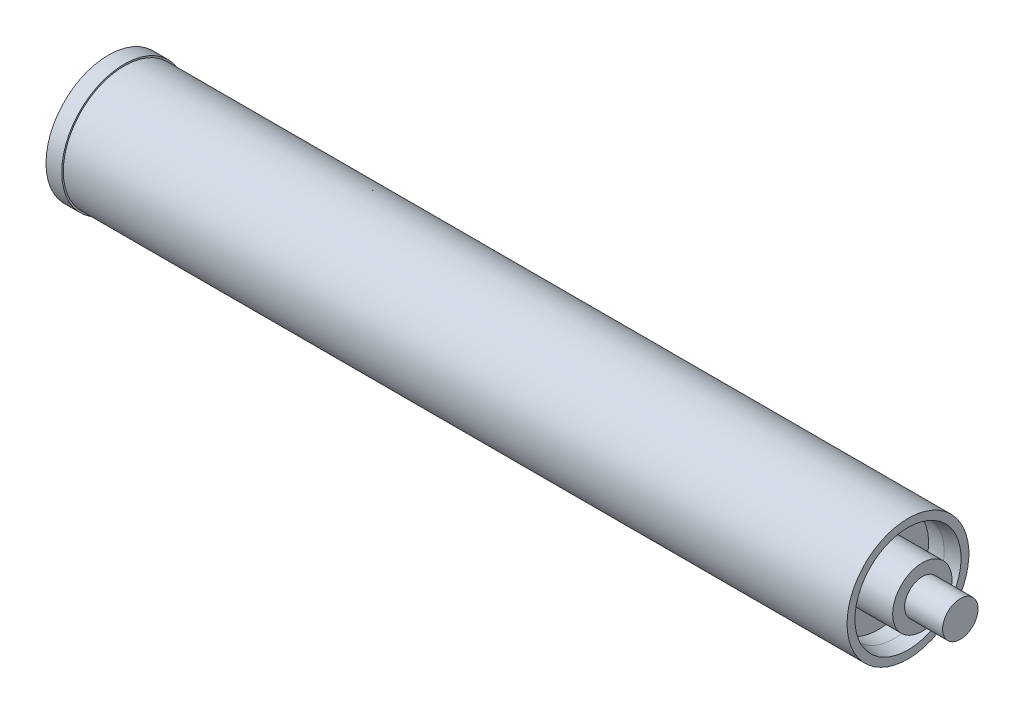
ISO-10303-21;
HEADER;
FILE_DESCRIPTION(('STEP AP214'),'2;1');
FILE_NAME('part.step','',(''),(''),'','','');
FILE_SCHEMA(('AUTOMOTIVE_DESIGN { 1 0 10303 214 1 1 1 1 }'));
ENDSEC;
DATA;
#1=APPLICATION_CONTEXT('core data for automotive mechanical design processes');
#2=APPLICATION_PROTOCOL_DEFINITION('international standard','automotive_design',2000,#1);
#3=PRODUCT_CONTEXT('',#1,'mechanical');
#4=PRODUCT('Part','Part','',(#3));
#5=PRODUCT_RELATED_PRODUCT_CATEGORY('part','',(#4));
#6=PRODUCT_DEFINITION_FORMATION('','',#4);
#7=PRODUCT_DEFINITION_CONTEXT('part definition',#1,'design');
#8=PRODUCT_DEFINITION('design','',#6,#7);
#9=PRODUCT_DEFINITION_SHAPE('','',#8);
#10=(LENGTH_UNIT() NAMED_UNIT(*) SI_UNIT(.MILLI.,.METRE.));
#11=(NAMED_UNIT(*) PLANE_ANGLE_UNIT() SI_UNIT($,.RADIAN.));
#12=(NAMED_UNIT(*) SI_UNIT($,.STERADIAN.) SOLID_ANGLE_UNIT());
#13=UNCERTAINTY_MEASURE_WITH_UNIT(LENGTH_MEASURE(1.E-05),#10,'distance_accuracy_value','');
#14=(GEOMETRIC_REPRESENTATION_CONTEXT(3) GLOBAL_UNCERTAINTY_ASSIGNED_CONTEXT((#13)) GLOBAL_UNIT_ASSIGNED_CONTEXT((#10,
#11,#12)) REPRESENTATION_CONTEXT('',''));
#15=CARTESIAN_POINT('',(0.,0.,0.));
#16=DIRECTION('',(0.,0.,1.));
#17=DIRECTION('',(1.,0.,0.));
#18=AXIS2_PLACEMENT_3D('',#15,#16,#17);
#19=CARTESIAN_POINT('',(36.5674158404261,35.6891384392189,0.));
#20=DIRECTION('',(1.,0.,0.));
#21=DIRECTION('',(0.,0.,-1.));
#22=AXIS2_PLACEMENT_3D('',#19,#20,#21);
#23=PLANE('',#22);
#24=CARTESIAN_POINT('',(36.5674158404261,0.,0.));
#25=DIRECTION('',(-1.,0.,0.));
#26=DIRECTION('',(0.,0.,1.));
#27=AXIS2_PLACEMENT_3D('',#24,#25,#26);
#28=CIRCLE('',#27,26.);
#29=CARTESIAN_POINT('',(36.5674158404261,0.,26.));
#30=VERTEX_POINT('',#29);
#31=EDGE_CURVE('E83',#30,#30,#28,.T.);
#32=ORIENTED_EDGE('',*,*,#31,.F.);
#33=EDGE_LOOP('',(#32));
#34=FACE_BOUND('',#33,.T.);
#35=CARTESIAN_POINT('',(36.5674158404261,0.,0.));
#36=DIRECTION('',(-1.,0.,0.));
#37=DIRECTION('',(0.,0.,1.));
#38=AXIS2_PLACEMENT_3D('',#35,#36,#37);
#39=CIRCLE('',#38,35.6891384392189);
#40=CARTESIAN_POINT('',(36.5674158404261,0.,35.6891384392189));
#41=VERTEX_POINT('',#40);
#42=EDGE_CURVE('E10',#41,#41,#39,.T.);
#43=ORIENTED_EDGE('',*,*,#42,.T.);
#44=EDGE_LOOP('',(#43));
#45=FACE_BOUND('',#44,.T.);
#46=ADVANCED_FACE('F31',(#34,#45),#23,.F.);
#47=CARTESIAN_POINT('',(0.,0.,0.));
#48=DIRECTION('',(-1.,0.,0.));
#49=DIRECTION('',(0.,0.,1.));
#50=AXIS2_PLACEMENT_3D('',#47,#48,#49);
#51=CYLINDRICAL_SURFACE('',#50,35.6891384392189);
#52=ORIENTED_EDGE('',*,*,#42,.F.);
#53=EDGE_LOOP('',(#52));
#54=FACE_BOUND('',#53,.T.);
#55=CARTESIAN_POINT('',(25.4,0.,0.));
#56=DIRECTION('',(-1.,0.,0.));
#57=DIRECTION('',(0.,0.,1.));
#58=AXIS2_PLACEMENT_3D('',#55,#56,#57);
#59=CIRCLE('',#58,35.6891384392189);
#60=CARTESIAN_POINT('',(25.4,0.,35.6891384392189));
#61=VERTEX_POINT('',#60);
#62=EDGE_CURVE('E37',#61,#61,#59,.T.);
#63=ORIENTED_EDGE('',*,*,#62,.T.);
#64=EDGE_LOOP('',(#63));
#65=FACE_BOUND('',#64,.T.);
#66=ADVANCED_FACE('F130',(#54,#65),#51,.F.);
#67=CARTESIAN_POINT('',(12.7,0.,0.));
#68=DIRECTION('',(-1.,0.,0.));
#69=DIRECTION('',(0.,0.,1.));
#70=AXIS2_PLACEMENT_3D('',#67,#68,#69);
#71=CONICAL_SURFACE('',#70,38.2095,0.195908259244877);
#72=ORIENTED_EDGE('',*,*,#62,.F.);
#73=EDGE_LOOP('',(#72));
#74=FACE_BOUND('',#73,.T.);
#75=CARTESIAN_POINT('',(12.7,0.,0.));
#76=DIRECTION('',(-1.,0.,0.));
#77=DIRECTION('',(0.,0.,1.));
#78=AXIS2_PLACEMENT_3D('',#75,#76,#77);
#79=CIRCLE('',#78,38.2095);
#80=CARTESIAN_POINT('',(12.7,0.,38.2095));
#81=VERTEX_POINT('',#80);
#82=EDGE_CURVE('E41',#81,#81,#79,.T.);
#83=ORIENTED_EDGE('',*,*,#82,.T.);
#84=EDGE_LOOP('',(#83));
#85=FACE_BOUND('',#84,.T.);
#86=ADVANCED_FACE('F135',(#74,#85),#71,.F.);
#87=CARTESIAN_POINT('',(12.7,50.419,0.));
#88=DIRECTION('',(1.,0.,0.));
#89=DIRECTION('',(0.,0.,-1.));
#90=AXIS2_PLACEMENT_3D('',#87,#88,#89);
#91=PLANE('',#90);
#92=ORIENTED_EDGE('',*,*,#82,.F.);
#93=EDGE_LOOP('',(#92));
#94=FACE_BOUND('',#93,.T.);
#95=CARTESIAN_POINT('',(12.7,0.,0.));
#96=DIRECTION('',(-1.,0.,0.));
#97=DIRECTION('',(0.,0.,1.));
#98=AXIS2_PLACEMENT_3D('',#95,#96,#97);
#99=CIRCLE('',#98,50.419);
#100=CARTESIAN_POINT('',(12.7,0.,50.419));
#101=VERTEX_POINT('',#100);
#102=EDGE_CURVE('E45',#101,#101,#99,.T.);
#103=ORIENTED_EDGE('',*,*,#102,.T.);
#104=EDGE_LOOP('',(#103));
#105=FACE_BOUND('',#104,.T.);
#106=ADVANCED_FACE('F141',(#94,#105),#91,.F.);
#107=CARTESIAN_POINT('',(0.,0.,0.));
#108=DIRECTION('',(-1.,0.,0.));
#109=DIRECTION('',(0.,0.,1.));
#110=AXIS2_PLACEMENT_3D('',#107,#108,#109);
#111=CYLINDRICAL_SURFACE('',#110,50.419);
#112=CARTESIAN_POINT('',(25.4,0.,0.));
#113=DIRECTION('',(-1.,0.,0.));
#114=DIRECTION('',(0.,0.,1.));
#115=AXIS2_PLACEMENT_3D('',#112,#113,#114);
#116=CIRCLE('',#115,50.419);
#117=CARTESIAN_POINT('',(25.4,0.,50.419));
#118=VERTEX_POINT('',#117);
#119=EDGE_CURVE('E50',#118,#118,#116,.T.);
#120=ORIENTED_EDGE('',*,*,#119,.T.);
#121=EDGE_LOOP('',(#120));
#122=FACE_BOUND('',#121,.T.);
#123=ORIENTED_EDGE('',*,*,#102,.F.);
#124=EDGE_LOOP('',(#123));
#125=FACE_BOUND('',#124,.T.);
#126=ADVANCED_FACE('F147',(#122,#125),#111,.T.);
#127=CARTESIAN_POINT('',(25.4,50.419,0.));
#128=DIRECTION('',(1.,0.,0.));
#129=DIRECTION('',(0.,0.,-1.));
#130=AXIS2_PLACEMENT_3D('',#127,#128,#129);
#131=PLANE('',#130);
#132=CARTESIAN_POINT('',(25.4,0.,0.));
#133=DIRECTION('',(-1.,0.,0.));
#134=DIRECTION('',(0.,0.,1.));
#135=AXIS2_PLACEMENT_3D('',#132,#133,#134);
#136=CIRCLE('',#135,49.149);
#137=CARTESIAN_POINT('',(25.4,0.,49.149));
#138=VERTEX_POINT('',#137);
#139=EDGE_CURVE('E53',#138,#138,#136,.T.);
#140=ORIENTED_EDGE('',*,*,#139,.T.);
#141=EDGE_LOOP('',(#140));
#142=FACE_BOUND('',#141,.T.);
#143=ORIENTED_EDGE('',*,*,#119,.F.);
#144=EDGE_LOOP('',(#143));
#145=FACE_BOUND('',#144,.T.);
#146=ADVANCED_FACE('F151',(#142,#145),#131,.T.);
#147=CARTESIAN_POINT('',(0.,0.,0.));
#148=DIRECTION('',(-1.,0.,0.));
#149=DIRECTION('',(0.,0.,1.));
#150=AXIS2_PLACEMENT_3D('',#147,#148,#149);
#151=CYLINDRICAL_SURFACE('',#150,49.149);
#152=CARTESIAN_POINT('',(657.7598,0.,0.));
#153=DIRECTION('',(-1.,0.,0.));
#154=DIRECTION('',(0.,0.,1.));
#155=AXIS2_PLACEMENT_3D('',#152,#153,#154);
#156=CIRCLE('',#155,49.149);
#157=CARTESIAN_POINT('',(657.7598,0.,49.149));
#158=VERTEX_POINT('',#157);
#159=EDGE_CURVE('E56',#158,#158,#156,.T.);
#160=ORIENTED_EDGE('',*,*,#159,.T.);
#161=EDGE_LOOP('',(#160));
#162=FACE_BOUND('',#161,.T.);
#163=ORIENTED_EDGE('',*,*,#139,.F.);
#164=EDGE_LOOP('',(#163));
#165=FACE_BOUND('',#164,.T.);
#166=ADVANCED_FACE('F155',(#162,#165),#151,.T.);
#167=CARTESIAN_POINT('',(657.7598,49.149,0.));
#168=DIRECTION('',(1.,0.,0.));
#169=DIRECTION('',(0.,0.,-1.));
#170=AXIS2_PLACEMENT_3D('',#167,#168,#169);
#171=PLANE('',#170);
#172=CARTESIAN_POINT('',(657.7598,0.,0.));
#173=DIRECTION('',(-1.,0.,0.));
#174=DIRECTION('',(0.,0.,1.));
#175=AXIS2_PLACEMENT_3D('',#172,#173,#174);
#176=CIRCLE('',#175,42.8201877110918);
#177=CARTESIAN_POINT('',(657.7598,0.,42.8201877110918));
#178=VERTEX_POINT('',#177);
#179=EDGE_CURVE('E59',#178,#178,#176,.T.);
#180=ORIENTED_EDGE('',*,*,#179,.T.);
#181=EDGE_LOOP('',(#180));
#182=FACE_BOUND('',#181,.T.);
#183=ORIENTED_EDGE('',*,*,#159,.F.);
#184=EDGE_LOOP('',(#183));
#185=FACE_BOUND('',#184,.T.);
#186=ADVANCED_FACE('F159',(#182,#185),#171,.T.);
#187=CARTESIAN_POINT('',(657.7598,0.,0.));
#188=DIRECTION('',(1.,0.,0.));
#189=DIRECTION('',(0.,0.,-1.));
#190=AXIS2_PLACEMENT_3D('',#187,#188,#189);
#191=CONICAL_SURFACE('',#190,42.8201877110918,0.195908259244877);
#192=CARTESIAN_POINT('',(646.436948349975,0.,0.));
#193=DIRECTION('',(-1.,0.,0.));
#194=DIRECTION('',(0.,0.,1.));
#195=AXIS2_PLACEMENT_3D('',#192,#193,#194);
#196=CIRCLE('',#195,40.573126289269);
#197=CARTESIAN_POINT('',(646.436948349975,0.,40.573126289269));
#198=VERTEX_POINT('',#197);
#199=EDGE_CURVE('E62',#198,#198,#196,.T.);
#200=ORIENTED_EDGE('',*,*,#199,.T.);
#201=EDGE_LOOP('',(#200));
#202=FACE_BOUND('',#201,.T.);
#203=ORIENTED_EDGE('',*,*,#179,.F.);
#204=EDGE_LOOP('',(#203));
#205=FACE_BOUND('',#204,.T.);
#206=ADVANCED_FACE('F163',(#202,#205),#191,.F.);
#207=CARTESIAN_POINT('',(0.,0.,0.));
#208=DIRECTION('',(-1.,0.,0.));
#209=DIRECTION('',(0.,0.,1.));
#210=AXIS2_PLACEMENT_3D('',#207,#208,#209);
#211=CYLINDRICAL_SURFACE('',#210,40.573126289269);
#212=CARTESIAN_POINT('',(633.864418394821,0.,0.));
#213=DIRECTION('',(-1.,0.,0.));
#214=DIRECTION('',(0.,0.,1.));
#215=AXIS2_PLACEMENT_3D('',#212,#213,#214);
#216=CIRCLE('',#215,40.573126289269);
#217=CARTESIAN_POINT('',(633.864418394821,0.,40.573126289269));
#218=VERTEX_POINT('',#217);
#219=EDGE_CURVE('E65',#218,#218,#216,.T.);
#220=ORIENTED_EDGE('',*,*,#219,.T.);
#221=EDGE_LOOP('',(#220));
#222=FACE_BOUND('',#221,.T.);
#223=ORIENTED_EDGE('',*,*,#199,.F.);
#224=EDGE_LOOP('',(#223));
#225=FACE_BOUND('',#224,.T.);
#226=ADVANCED_FACE('F167',(#222,#225),#211,.F.);
#227=CARTESIAN_POINT('',(633.864418394821,40.573126289269,0.));
#228=DIRECTION('',(1.,0.,0.));
#229=DIRECTION('',(0.,0.,-1.));
#230=AXIS2_PLACEMENT_3D('',#227,#228,#229);
#231=PLANE('',#230);
#232=CARTESIAN_POINT('',(633.864418394821,0.,0.));
#233=DIRECTION('',(-1.,0.,0.));
#234=DIRECTION('',(0.,0.,1.));
#235=AXIS2_PLACEMENT_3D('',#232,#233,#234);
#236=CIRCLE('',#235,23.9395);
#237=CARTESIAN_POINT('',(633.864418394821,0.,23.9395));
#238=VERTEX_POINT('',#237);
#239=EDGE_CURVE('E68',#238,#238,#236,.T.);
#240=ORIENTED_EDGE('',*,*,#239,.T.);
#241=EDGE_LOOP('',(#240));
#242=FACE_BOUND('',#241,.T.);
#243=ORIENTED_EDGE('',*,*,#219,.F.);
#244=EDGE_LOOP('',(#243));
#245=FACE_BOUND('',#244,.T.);
#246=ADVANCED_FACE('F171',(#242,#245),#231,.T.);
#247=CARTESIAN_POINT('',(0.,0.,0.));
#248=DIRECTION('',(-1.,0.,0.));
#249=DIRECTION('',(0.,0.,1.));
#250=AXIS2_PLACEMENT_3D('',#247,#248,#249);
#251=CYLINDRICAL_SURFACE('',#250,23.9395);
#252=CARTESIAN_POINT('',(669.332507906623,0.,0.));
#253=DIRECTION('',(-1.,0.,0.));
#254=DIRECTION('',(0.,0.,1.));
#255=AXIS2_PLACEMENT_3D('',#252,#253,#254);
#256=CIRCLE('',#255,23.9395);
#257=CARTESIAN_POINT('',(669.332507906623,0.,23.9395));
#258=VERTEX_POINT('',#257);
#259=EDGE_CURVE('E71',#258,#258,#256,.T.);
#260=ORIENTED_EDGE('',*,*,#259,.T.);
#261=EDGE_LOOP('',(#260));
#262=FACE_BOUND('',#261,.T.);
#263=ORIENTED_EDGE('',*,*,#239,.F.);
#264=EDGE_LOOP('',(#263));
#265=FACE_BOUND('',#264,.T.);
#266=ADVANCED_FACE('F175',(#262,#265),#251,.T.);
#267=CARTESIAN_POINT('',(669.332507906623,23.9395,0.));
#268=DIRECTION('',(1.,0.,0.));
#269=DIRECTION('',(0.,0.,-1.));
#270=AXIS2_PLACEMENT_3D('',#267,#268,#269);
#271=PLANE('',#270);
#272=CARTESIAN_POINT('',(669.332507906623,0.,0.));
#273=DIRECTION('',(-1.,0.,0.));
#274=DIRECTION('',(0.,0.,1.));
#275=AXIS2_PLACEMENT_3D('',#272,#273,#274);
#276=CIRCLE('',#275,14.2875);
#277=CARTESIAN_POINT('',(669.332507906623,0.,14.2875));
#278=VERTEX_POINT('',#277);
#279=EDGE_CURVE('E74',#278,#278,#276,.T.);
#280=ORIENTED_EDGE('',*,*,#279,.T.);
#281=EDGE_LOOP('',(#280));
#282=FACE_BOUND('',#281,.T.);
#283=ORIENTED_EDGE('',*,*,#259,.F.);
#284=EDGE_LOOP('',(#283));
#285=FACE_BOUND('',#284,.T.);
#286=ADVANCED_FACE('F179',(#282,#285),#271,.T.);
#287=CARTESIAN_POINT('',(0.,0.,0.));
#288=DIRECTION('',(-1.,0.,0.));
#289=DIRECTION('',(0.,0.,1.));
#290=AXIS2_PLACEMENT_3D('',#287,#288,#289);
#291=CYLINDRICAL_SURFACE('',#290,14.2875);
#292=CARTESIAN_POINT('',(700.,0.,0.));
#293=DIRECTION('',(-1.,0.,0.));
#294=DIRECTION('',(0.,0.,1.));
#295=AXIS2_PLACEMENT_3D('',#292,#293,#294);
#296=CIRCLE('',#295,14.2875);
#297=CARTESIAN_POINT('',(700.,0.,14.2875));
#298=VERTEX_POINT('',#297);
#299=EDGE_CURVE('E77',#298,#298,#296,.T.);
#300=ORIENTED_EDGE('',*,*,#299,.T.);
#301=EDGE_LOOP('',(#300));
#302=FACE_BOUND('',#301,.T.);
#303=ORIENTED_EDGE('',*,*,#279,.F.);
#304=EDGE_LOOP('',(#303));
#305=FACE_BOUND('',#304,.T.);
#306=ADVANCED_FACE('F183',(#302,#305),#291,.T.);
#307=CARTESIAN_POINT('',(700.,0.,0.));
#308=DIRECTION('',(-1.,0.,0.));
#309=DIRECTION('',(0.,0.,1.));
#310=AXIS2_PLACEMENT_3D('',#307,#308,#309);
#311=PLANE('',#310);
#312=ORIENTED_EDGE('',*,*,#299,.F.);
#313=EDGE_LOOP('',(#312));
#314=FACE_BOUND('',#313,.T.);
#315=ADVANCED_FACE('F115',(#314),#311,.F.);
#316=CARTESIAN_POINT('',(0.,26.,0.));
#317=DIRECTION('',(1.,0.,0.));
#318=DIRECTION('',(0.,0.,-1.));
#319=AXIS2_PLACEMENT_3D('',#316,#317,#318);
#320=PLANE('',#319);
#321=CARTESIAN_POINT('',(0.,0.,0.));
#322=DIRECTION('',(-1.,0.,0.));
#323=DIRECTION('',(0.,0.,1.));
#324=AXIS2_PLACEMENT_3D('',#321,#322,#323);
#325=CIRCLE('',#324,20.);
#326=CARTESIAN_POINT('',(0.,0.,20.));
#327=VERTEX_POINT('',#326);
#328=EDGE_CURVE('E104',#327,#327,#325,.T.);
#329=ORIENTED_EDGE('',*,*,#328,.F.);
#330=EDGE_LOOP('',(#329));
#331=FACE_BOUND('',#330,.T.);
#332=CARTESIAN_POINT('',(0.,0.,0.));
#333=DIRECTION('',(-1.,0.,0.));
#334=DIRECTION('',(0.,0.,1.));
#335=AXIS2_PLACEMENT_3D('',#332,#333,#334);
#336=CIRCLE('',#335,26.);
#337=CARTESIAN_POINT('',(0.,0.,26.));
#338=VERTEX_POINT('',#337);
#339=EDGE_CURVE('E80',#338,#338,#336,.T.);
#340=ORIENTED_EDGE('',*,*,#339,.T.);
#341=EDGE_LOOP('',(#340));
#342=FACE_BOUND('',#341,.T.);
#343=ADVANCED_FACE('F111',(#331,#342),#320,.F.);
#344=CARTESIAN_POINT('',(0.,0.,0.));
#345=DIRECTION('',(-1.,0.,0.));
#346=DIRECTION('',(0.,0.,1.));
#347=AXIS2_PLACEMENT_3D('',#344,#345,#346);
#348=CYLINDRICAL_SURFACE('',#347,26.);
#349=ORIENTED_EDGE('',*,*,#31,.T.);
#350=EDGE_LOOP('',(#349));
#351=FACE_BOUND('',#350,.T.);
#352=ORIENTED_EDGE('',*,*,#339,.F.);
#353=EDGE_LOOP('',(#352));
#354=FACE_BOUND('',#353,.T.);
#355=ADVANCED_FACE('F114',(#351,#354),#348,.T.);
#356=CARTESIAN_POINT('',(633.864418394821,0.,0.));
#357=DIRECTION('',(-1.,0.,0.));
#358=DIRECTION('',(0.,0.,1.));
#359=AXIS2_PLACEMENT_3D('',#356,#357,#358);
#360=PLANE('',#359);
#361=CARTESIAN_POINT('',(633.864418394821,0.,0.));
#362=DIRECTION('',(-1.,0.,0.));
#363=DIRECTION('',(0.,0.,1.));
#364=AXIS2_PLACEMENT_3D('',#361,#362,#363);
#365=CIRCLE('',#364,12.9577572212731);
#366=CARTESIAN_POINT('',(633.864418394821,0.,12.9577572212731));
#367=VERTEX_POINT('',#366);
#368=EDGE_CURVE('E86',#367,#367,#365,.T.);
#369=ORIENTED_EDGE('',*,*,#368,.T.);
#370=EDGE_LOOP('',(#369));
#371=FACE_BOUND('',#370,.T.);
#372=ADVANCED_FACE('F120',(#371),#360,.T.);
#373=CARTESIAN_POINT('',(0.,0.,0.));
#374=DIRECTION('',(-1.,0.,0.));
#375=DIRECTION('',(0.,0.,1.));
#376=AXIS2_PLACEMENT_3D('',#373,#374,#375);
#377=CYLINDRICAL_SURFACE('',#376,12.9577572212731);
#378=CARTESIAN_POINT('',(616.513878226843,0.,0.));
#379=DIRECTION('',(-1.,0.,0.));
#380=DIRECTION('',(0.,0.,1.));
#381=AXIS2_PLACEMENT_3D('',#378,#379,#380);
#382=CIRCLE('',#381,12.9577572212731);
#383=CARTESIAN_POINT('',(616.513878226843,0.,12.9577572212731));
#384=VERTEX_POINT('',#383);
#385=EDGE_CURVE('E89',#384,#384,#382,.T.);
#386=ORIENTED_EDGE('',*,*,#385,.T.);
#387=EDGE_LOOP('',(#386));
#388=FACE_BOUND('',#387,.T.);
#389=ORIENTED_EDGE('',*,*,#368,.F.);
#390=EDGE_LOOP('',(#389));
#391=FACE_BOUND('',#390,.T.);
#392=ADVANCED_FACE('F126',(#388,#391),#377,.F.);
#393=CARTESIAN_POINT('',(616.513878226843,12.9577572212731,0.));
#394=DIRECTION('',(-1.,0.,0.));
#395=DIRECTION('',(0.,0.,1.));
#396=AXIS2_PLACEMENT_3D('',#393,#394,#395);
#397=PLANE('',#396);
#398=CARTESIAN_POINT('',(616.513878226843,0.,0.));
#399=DIRECTION('',(-1.,0.,0.));
#400=DIRECTION('',(0.,0.,1.));
#401=AXIS2_PLACEMENT_3D('',#398,#399,#400);
#402=CIRCLE('',#401,44.271024872523);
#403=CARTESIAN_POINT('',(616.513878226843,0.,44.271024872523));
#404=VERTEX_POINT('',#403);
#405=EDGE_CURVE('E92',#404,#404,#402,.T.);
#406=ORIENTED_EDGE('',*,*,#405,.T.);
#407=EDGE_LOOP('',(#406));
#408=FACE_BOUND('',#407,.T.);
#409=ORIENTED_EDGE('',*,*,#385,.F.);
#410=EDGE_LOOP('',(#409));
#411=FACE_BOUND('',#410,.T.);
#412=ADVANCED_FACE('F238',(#408,#411),#397,.T.);
#413=CARTESIAN_POINT('',(0.,0.,0.));
#414=DIRECTION('',(-1.,0.,0.));
#415=DIRECTION('',(0.,0.,1.));
#416=AXIS2_PLACEMENT_3D('',#413,#414,#415);
#417=CYLINDRICAL_SURFACE('',#416,44.271024872523);
#418=CARTESIAN_POINT('',(65.8718789343533,0.,0.));
#419=DIRECTION('',(-1.,0.,0.));
#420=DIRECTION('',(0.,0.,1.));
#421=AXIS2_PLACEMENT_3D('',#418,#419,#420);
#422=CIRCLE('',#421,44.271024872523);
#423=CARTESIAN_POINT('',(65.8718789343533,0.,-44.271024872523));
#424=VERTEX_POINT('',#423);
#425=EDGE_CURVE('E95',#424,#424,#422,.T.);
#426=ORIENTED_EDGE('',*,*,#425,.T.);
#427=EDGE_LOOP('',(#426));
#428=FACE_BOUND('',#427,.T.);
#429=ORIENTED_EDGE('',*,*,#405,.F.);
#430=EDGE_LOOP('',(#429));
#431=FACE_BOUND('',#430,.T.);
#432=ADVANCED_FACE('F248',(#428,#431),#417,.F.);
#433=CARTESIAN_POINT('',(65.8718789343533,0.,0.));
#434=DIRECTION('',(1.,0.,0.));
#435=DIRECTION('',(0.,0.,-1.));
#436=AXIS2_PLACEMENT_3D('',#433,#434,#435);
#437=CONICAL_SURFACE('',#436,44.271024872523,0.755513024128266);
#438=CARTESIAN_POINT('',(34.0830061399178,0.,0.));
#439=DIRECTION('',(-1.,0.,0.));
#440=DIRECTION('',(0.,0.,1.));
#441=AXIS2_PLACEMENT_3D('',#438,#439,#440);
#442=CIRCLE('',#441,14.3275804068006);
#443=CARTESIAN_POINT('',(34.0830061399178,0.,-14.3275804068006));
#444=VERTEX_POINT('',#443);
#445=EDGE_CURVE('E98',#444,#444,#442,.T.);
#446=CARTESIAN_POINT('',(34.0830061399178,0.,-14.3275804068006));
#447=CARTESIAN_POINT('',(34.4141402315265,0.,-14.6394912866519));
#448=CARTESIAN_POINT('',(34.7452743231352,0.,-14.9514021665031));
#449=CARTESIAN_POINT('',(35.4075425063526,0.,-15.5752239262057));
#450=CARTESIAN_POINT('',(35.7386765979613,0.,-15.887134806057));
#451=CARTESIAN_POINT('',(36.4009447811787,0.,-16.5109565657595));
#452=CARTESIAN_POINT('',(36.7320788727874,0.,-16.8228674456108));
#453=CARTESIAN_POINT('',(37.3943470560048,0.,-17.4466892053133));
#454=CARTESIAN_POINT('',(37.7254811476135,0.,-17.7586000851646));
#455=CARTESIAN_POINT('',(38.3877493308309,0.,-18.3824218448672));
#456=CARTESIAN_POINT('',(38.7188834224396,0.,-18.6943327247184));
#457=CARTESIAN_POINT('',(39.381151605657,0.,-19.318154484421));
#458=CARTESIAN_POINT('',(39.7122856972657,0.,-19.6300653642723));
#459=CARTESIAN_POINT('',(40.3745538804831,0.,-20.2538871239748));
#460=CARTESIAN_POINT('',(40.7056879720918,0.,-20.5657980038261));
#461=CARTESIAN_POINT('',(41.3679561553093,0.,-21.1896197635286));
#462=CARTESIAN_POINT('',(41.699090246918,0.,-21.5015306433799));
#463=CARTESIAN_POINT('',(42.3613584301354,0.,-22.1253524030825));
#464=CARTESIAN_POINT('',(42.6924925217441,0.,-22.4372632829337));
#465=CARTESIAN_POINT('',(43.3547607049615,0.,-23.0610850426363));
#466=CARTESIAN_POINT('',(43.6858947965702,0.,-23.3729959224876));
#467=CARTESIAN_POINT('',(44.3481629797876,0.,-23.9968176821901));
#468=CARTESIAN_POINT('',(44.6792970713963,0.,-24.3087285620414));
#469=CARTESIAN_POINT('',(45.3415652546137,0.,-24.9325503217439));
#470=CARTESIAN_POINT('',(45.6726993462224,0.,-25.2444612015952));
#471=CARTESIAN_POINT('',(46.3349675294398,0.,-25.8682829612978));
#472=CARTESIAN_POINT('',(46.6661016210485,0.,-26.180193841149));
#473=CARTESIAN_POINT('',(47.3283698042659,0.,-26.8040156008516));
#474=CARTESIAN_POINT('',(47.6595038958746,0.,-27.1159264807029));
#475=CARTESIAN_POINT('',(48.321772079092,0.,-27.7397482404054));
#476=CARTESIAN_POINT('',(48.6529061707007,0.,-28.0516591202567));
#477=CARTESIAN_POINT('',(49.3151743539181,0.,-28.6754808799592));
#478=CARTESIAN_POINT('',(49.6463084455268,0.,-28.9873917598105));
#479=CARTESIAN_POINT('',(50.3085766287442,0.,-29.6112135195131));
#480=CARTESIAN_POINT('',(50.6397107203529,0.,-29.9231243993643));
#481=CARTESIAN_POINT('',(51.3019789035703,0.,-30.5469461590669));
#482=CARTESIAN_POINT('',(51.633112995179,0.,-30.8588570389182));
#483=CARTESIAN_POINT('',(52.2953811783965,0.,-31.4826787986207));
#484=CARTESIAN_POINT('',(52.6265152700052,0.,-31.794589678472));
#485=CARTESIAN_POINT('',(53.2887834532226,0.,-32.4184114381745));
#486=CARTESIAN_POINT('',(53.6199175448313,0.,-32.7303223180258));
#487=CARTESIAN_POINT('',(54.2821857280487,0.,-33.3541440777284));
#488=CARTESIAN_POINT('',(54.6133198196574,0.,-33.6660549575796));
#489=CARTESIAN_POINT('',(55.2755880028748,0.,-34.2898767172822));
#490=CARTESIAN_POINT('',(55.6067220944835,0.,-34.6017875971335));
#491=CARTESIAN_POINT('',(56.2689902777009,0.,-35.225609356836));
#492=CARTESIAN_POINT('',(56.6001243693096,0.,-35.5375202366873));
#493=CARTESIAN_POINT('',(57.262392552527,0.,-36.1613419963898));
#494=CARTESIAN_POINT('',(57.5935266441357,0.,-36.4732528762411));
#495=CARTESIAN_POINT('',(58.2557948273531,0.,-37.0970746359437));
#496=CARTESIAN_POINT('',(58.5869289189618,0.,-37.4089855157949));
#497=CARTESIAN_POINT('',(59.2491971021792,0.,-38.0328072754975));
#498=CARTESIAN_POINT('',(59.5803311937879,0.,-38.3447181553488));
#499=CARTESIAN_POINT('',(60.2425993770053,0.,-38.9685399150513));
#500=CARTESIAN_POINT('',(60.573733468614,0.,-39.2804507949026));
#501=CARTESIAN_POINT('',(61.2360016518314,0.,-39.9042725546051));
#502=CARTESIAN_POINT('',(61.5671357434401,0.,-40.2161834344564));
#503=CARTESIAN_POINT('',(62.2294039266575,0.,-40.840005194159));
#504=CARTESIAN_POINT('',(62.5605380182663,0.,-41.1519160740102));
#505=CARTESIAN_POINT('',(63.2228062014837,0.,-41.7757378337128));
#506=CARTESIAN_POINT('',(63.5539402930924,0.,-42.0876487135641));
#507=CARTESIAN_POINT('',(64.2162084763098,0.,-42.7114704732666));
#508=CARTESIAN_POINT('',(64.5473425679185,0.,-43.0233813531179));
#509=CARTESIAN_POINT('',(65.2096107511359,0.,-43.6472031128204));
#510=CARTESIAN_POINT('',(65.5407448427446,0.,-43.9591139926717));
#511=CARTESIAN_POINT('',(65.8718789343533,0.,-44.271024872523));
#512=B_SPLINE_CURVE_WITH_KNOTS('',3,(#446,#447,#448,#449,#450,#451,#452,#453,#454,#455,#456,
#457,#458,#459,#460,#461,#462,#463,#464,#465,#466,#467,#468,#469,#470,#471,#472,#473,#474,#475,
#476,#477,#478,#479,#480,#481,#482,#483,#484,#485,#486,#487,#488,#489,#490,#491,#492,#493,#494,
#495,#496,#497,#498,#499,#500,#501,#502,#503,#504,#505,#506,#507,#508,#509,#510,#511),
.UNSPECIFIED.,.F.,.F.,(4,2,2,2,2,2,2,2,2,2,2,2,2,2,2,2,2,2,2,2,2,2,2,2,2,2,2,2,2,2,2,2,4),(0.,
1.36471376206004,2.72942752412007,4.09414128618011,5.45885504824014,6.82356881030018,
8.18828257236022,9.55299633442025,10.9177100964803,12.2824238585403,13.6471376206004,
15.0118513826604,16.3765651447204,17.7412789067805,19.1059926688405,20.4707064309005,
21.8354201929606,23.2001339550206,24.5648477170806,25.9295614791407,27.2942752412007,
28.6589890032608,30.0237027653208,31.3884165273808,32.7531302894409,34.1178440515009,
35.4825578135609,36.847271575621,38.211985337681,39.576699099741,40.9414128618011,
42.3061266238611,43.6708403859212),.UNSPECIFIED.);
#513=EDGE_CURVE('BSEAM258',#444,#424,#512,.T.);
#514=ORIENTED_EDGE('',*,*,#445,.T.);
#515=ORIENTED_EDGE('',*,*,#425,.F.);
#516=ORIENTED_EDGE('',*,*,#513,.T.);
#517=ORIENTED_EDGE('',*,*,#513,.F.);
#518=EDGE_LOOP('',(#514,#516,#515,#517));
#519=FACE_BOUND('',#518,.T.);
#520=ADVANCED_FACE('F258',(#519),#437,.F.);
#521=CARTESIAN_POINT('',(0.,0.,0.));
#522=DIRECTION('',(-1.,0.,0.));
#523=DIRECTION('',(0.,0.,1.));
#524=AXIS2_PLACEMENT_3D('',#521,#522,#523);
#525=CYLINDRICAL_SURFACE('',#524,14.3275804068006);
#526=CARTESIAN_POINT('',(19.0830061399178,0.,0.));
#527=DIRECTION('',(-1.,0.,0.));
#528=DIRECTION('',(0.,0.,1.));
#529=AXIS2_PLACEMENT_3D('',#526,#527,#528);
#530=CIRCLE('',#529,14.3275804068006);
#531=CARTESIAN_POINT('',(19.0830061399178,0.,14.3275804068006));
#532=VERTEX_POINT('',#531);
#533=EDGE_CURVE('E101',#532,#532,#530,.T.);
#534=ORIENTED_EDGE('',*,*,#533,.T.);
#535=EDGE_LOOP('',(#534));
#536=FACE_BOUND('',#535,.T.);
#537=ORIENTED_EDGE('',*,*,#445,.F.);
#538=EDGE_LOOP('',(#537));
#539=FACE_BOUND('',#538,.T.);
#540=ADVANCED_FACE('F268',(#536,#539),#525,.F.);
#541=CARTESIAN_POINT('',(19.0830061399178,0.,0.));
#542=DIRECTION('',(-1.,0.,0.));
#543=DIRECTION('',(0.,0.,1.));
#544=AXIS2_PLACEMENT_3D('',#541,#542,#543);
#545=CONICAL_SURFACE('',#544,14.3275804068006,0.288931761333724);
#546=ORIENTED_EDGE('',*,*,#328,.T.);
#547=EDGE_LOOP('',(#546));
#548=FACE_BOUND('',#547,.T.);
#549=ORIENTED_EDGE('',*,*,#533,.F.);
#550=EDGE_LOOP('',(#549));
#551=FACE_BOUND('',#550,.T.);
#552=ADVANCED_FACE('F108',(#548,#551),#545,.F.);
#553=CLOSED_SHELL('',(#46,#66,#86,#106,#126,#146,#166,#186,#206,#226,#246,#266,#286,#306,#315,
#343,#355,#372,#392,#412,#432,#520,#540,#552));
#554=MANIFOLD_SOLID_BREP('B2',#553);
#555=ADVANCED_BREP_SHAPE_REPRESENTATION('',(#18,#554),#14);
#556=SHAPE_DEFINITION_REPRESENTATION(#9,#555);
ENDSEC;
END-ISO-10303-21;
